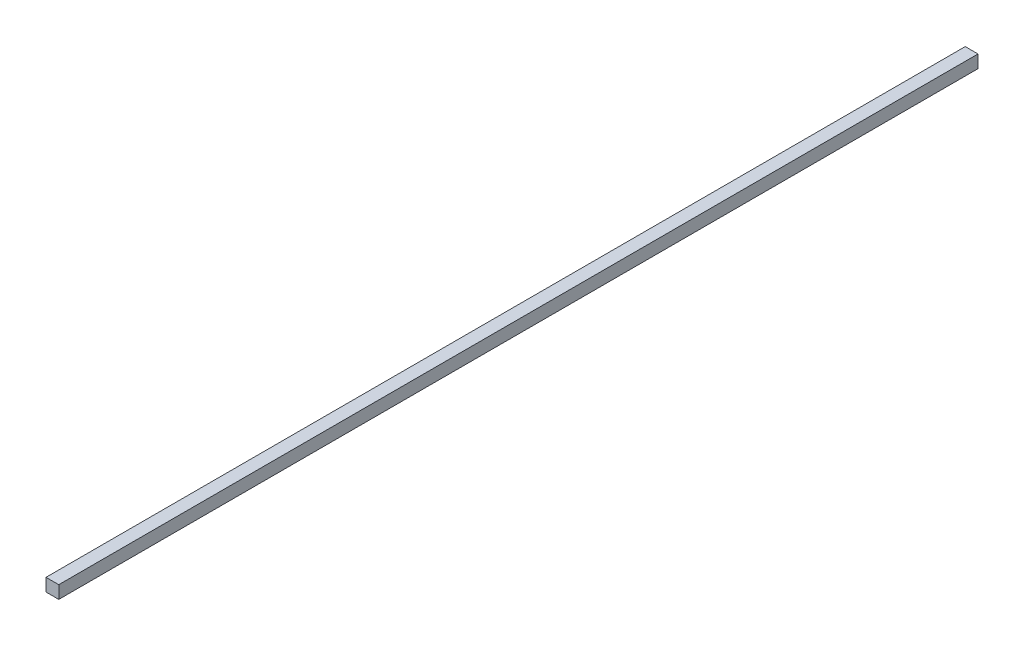
ISO-10303-21;
HEADER;
FILE_DESCRIPTION(('STEP AP214'),'2;1');
FILE_NAME('part.step','',(''),(''),'','','');
FILE_SCHEMA(('AUTOMOTIVE_DESIGN { 1 0 10303 214 1 1 1 1 }'));
ENDSEC;
DATA;
#1=APPLICATION_CONTEXT('core data for automotive mechanical design processes');
#2=APPLICATION_PROTOCOL_DEFINITION('international standard','automotive_design',2000,#1);
#3=PRODUCT_CONTEXT('',#1,'mechanical');
#4=PRODUCT('Part','Part','',(#3));
#5=PRODUCT_RELATED_PRODUCT_CATEGORY('part','',(#4));
#6=PRODUCT_DEFINITION_FORMATION('','',#4);
#7=PRODUCT_DEFINITION_CONTEXT('part definition',#1,'design');
#8=PRODUCT_DEFINITION('design','',#6,#7);
#9=PRODUCT_DEFINITION_SHAPE('','',#8);
#10=(LENGTH_UNIT() NAMED_UNIT(*) SI_UNIT(.MILLI.,.METRE.));
#11=(NAMED_UNIT(*) PLANE_ANGLE_UNIT() SI_UNIT($,.RADIAN.));
#12=(NAMED_UNIT(*) SI_UNIT($,.STERADIAN.) SOLID_ANGLE_UNIT());
#13=UNCERTAINTY_MEASURE_WITH_UNIT(LENGTH_MEASURE(1.E-05),#10,'distance_accuracy_value','');
#14=(GEOMETRIC_REPRESENTATION_CONTEXT(3) GLOBAL_UNCERTAINTY_ASSIGNED_CONTEXT((#13)) GLOBAL_UNIT_ASSIGNED_CONTEXT((#10,
#11,#12)) REPRESENTATION_CONTEXT('',''));
#15=CARTESIAN_POINT('',(0.,0.,0.));
#16=DIRECTION('',(0.,0.,1.));
#17=DIRECTION('',(1.,0.,0.));
#18=AXIS2_PLACEMENT_3D('',#15,#16,#17);
#19=CARTESIAN_POINT('',(10.,-10.,1440.));
#20=DIRECTION('',(-1.,0.,0.));
#21=DIRECTION('',(0.,0.,1.));
#22=AXIS2_PLACEMENT_3D('',#19,#20,#21);
#23=PLANE('',#22);
#24=DIRECTION('',(0.,1.,0.));
#25=VECTOR('',#24,1.);
#26=CARTESIAN_POINT('',(10.,-10.,0.));
#27=LINE('',#26,#25);
#28=CARTESIAN_POINT('',(10.,-10.,0.));
#29=VERTEX_POINT('',#28);
#30=CARTESIAN_POINT('',(10.,10.,0.));
#31=VERTEX_POINT('',#30);
#32=EDGE_CURVE('E97',#29,#31,#27,.T.);
#33=ORIENTED_EDGE('',*,*,#32,.T.);
#34=DIRECTION('',(0.,0.,-1.));
#35=VECTOR('',#34,1.);
#36=CARTESIAN_POINT('',(10.,10.,1440.));
#37=LINE('',#36,#35);
#38=CARTESIAN_POINT('',(10.,10.,1440.));
#39=VERTEX_POINT('',#38);
#40=EDGE_CURVE('E11',#39,#31,#37,.T.);
#41=ORIENTED_EDGE('',*,*,#40,.F.);
#42=DIRECTION('',(0.,1.,0.));
#43=VECTOR('',#42,1.);
#44=CARTESIAN_POINT('',(10.,-10.,1440.));
#45=LINE('',#44,#43);
#46=CARTESIAN_POINT('',(10.,-10.,1440.));
#47=VERTEX_POINT('',#46);
#48=EDGE_CURVE('E85',#47,#39,#45,.T.);
#49=ORIENTED_EDGE('',*,*,#48,.F.);
#50=DIRECTION('',(0.,0.,-1.));
#51=VECTOR('',#50,1.);
#52=CARTESIAN_POINT('',(10.,-10.,1440.));
#53=LINE('',#52,#51);
#54=EDGE_CURVE('E93',#47,#29,#53,.T.);
#55=ORIENTED_EDGE('',*,*,#54,.T.);
#56=EDGE_LOOP('',(#33,#41,#49,#55));
#57=FACE_BOUND('',#56,.T.);
#58=ADVANCED_FACE('F34',(#57),#23,.F.);
#59=CARTESIAN_POINT('',(-10.,10.,1440.));
#60=DIRECTION('',(0.,-1.,0.));
#61=DIRECTION('',(0.,0.,-1.));
#62=AXIS2_PLACEMENT_3D('',#59,#60,#61);
#63=PLANE('',#62);
#64=DIRECTION('',(-1.,0.,0.));
#65=VECTOR('',#64,1.);
#66=CARTESIAN_POINT('',(-10.,10.,0.));
#67=LINE('',#66,#65);
#68=CARTESIAN_POINT('',(-10.,10.,0.));
#69=VERTEX_POINT('',#68);
#70=EDGE_CURVE('E89',#31,#69,#67,.T.);
#71=ORIENTED_EDGE('',*,*,#70,.T.);
#72=DIRECTION('',(0.,0.,-1.));
#73=VECTOR('',#72,1.);
#74=CARTESIAN_POINT('',(-10.,10.,1440.));
#75=LINE('',#74,#73);
#76=CARTESIAN_POINT('',(-10.,10.,1440.));
#77=VERTEX_POINT('',#76);
#78=EDGE_CURVE('E42',#77,#69,#75,.T.);
#79=ORIENTED_EDGE('',*,*,#78,.F.);
#80=DIRECTION('',(-1.,0.,0.));
#81=VECTOR('',#80,1.);
#82=CARTESIAN_POINT('',(-10.,10.,1440.));
#83=LINE('',#82,#81);
#84=EDGE_CURVE('E80',#39,#77,#83,.T.);
#85=ORIENTED_EDGE('',*,*,#84,.F.);
#86=ORIENTED_EDGE('',*,*,#40,.T.);
#87=EDGE_LOOP('',(#71,#79,#85,#86));
#88=FACE_BOUND('',#87,.T.);
#89=ADVANCED_FACE('F88',(#88),#63,.F.);
#90=CARTESIAN_POINT('',(-10.,-10.,1440.));
#91=DIRECTION('',(1.,0.,0.));
#92=DIRECTION('',(0.,0.,-1.));
#93=AXIS2_PLACEMENT_3D('',#90,#91,#92);
#94=PLANE('',#93);
#95=DIRECTION('',(0.,-1.,0.));
#96=VECTOR('',#95,1.);
#97=CARTESIAN_POINT('',(-10.,-10.,0.));
#98=LINE('',#97,#96);
#99=CARTESIAN_POINT('',(-10.,-10.,0.));
#100=VERTEX_POINT('',#99);
#101=EDGE_CURVE('E67',#69,#100,#98,.T.);
#102=ORIENTED_EDGE('',*,*,#101,.T.);
#103=DIRECTION('',(0.,0.,-1.));
#104=VECTOR('',#103,1.);
#105=CARTESIAN_POINT('',(-10.,-10.,1440.));
#106=LINE('',#105,#104);
#107=CARTESIAN_POINT('',(-10.,-10.,1440.));
#108=VERTEX_POINT('',#107);
#109=EDGE_CURVE('E90',#108,#100,#106,.T.);
#110=ORIENTED_EDGE('',*,*,#109,.F.);
#111=DIRECTION('',(0.,-1.,0.));
#112=VECTOR('',#111,1.);
#113=CARTESIAN_POINT('',(-10.,-10.,1440.));
#114=LINE('',#113,#112);
#115=EDGE_CURVE('E83',#77,#108,#114,.T.);
#116=ORIENTED_EDGE('',*,*,#115,.F.);
#117=ORIENTED_EDGE('',*,*,#78,.T.);
#118=EDGE_LOOP('',(#102,#110,#116,#117));
#119=FACE_BOUND('',#118,.T.);
#120=ADVANCED_FACE('F91',(#119),#94,.F.);
#121=CARTESIAN_POINT('',(-10.,-10.,1440.));
#122=DIRECTION('',(0.,1.,0.));
#123=DIRECTION('',(0.,0.,1.));
#124=AXIS2_PLACEMENT_3D('',#121,#122,#123);
#125=PLANE('',#124);
#126=DIRECTION('',(1.,0.,0.));
#127=VECTOR('',#126,1.);
#128=CARTESIAN_POINT('',(-10.,-10.,0.));
#129=LINE('',#128,#127);
#130=EDGE_CURVE('E73',#100,#29,#129,.T.);
#131=ORIENTED_EDGE('',*,*,#130,.T.);
#132=ORIENTED_EDGE('',*,*,#54,.F.);
#133=DIRECTION('',(1.,0.,0.));
#134=VECTOR('',#133,1.);
#135=CARTESIAN_POINT('',(-10.,-10.,1440.));
#136=LINE('',#135,#134);
#137=EDGE_CURVE('E50',#108,#47,#136,.T.);
#138=ORIENTED_EDGE('',*,*,#137,.F.);
#139=ORIENTED_EDGE('',*,*,#109,.T.);
#140=EDGE_LOOP('',(#131,#132,#138,#139));
#141=FACE_BOUND('',#140,.T.);
#142=ADVANCED_FACE('F104',(#141),#125,.F.);
#143=CARTESIAN_POINT('',(0.,0.,1440.));
#144=DIRECTION('',(0.,0.,-1.));
#145=DIRECTION('',(-1.,0.,0.));
#146=AXIS2_PLACEMENT_3D('',#143,#144,#145);
#147=PLANE('',#146);
#148=ORIENTED_EDGE('',*,*,#48,.T.);
#149=ORIENTED_EDGE('',*,*,#84,.T.);
#150=ORIENTED_EDGE('',*,*,#115,.T.);
#151=ORIENTED_EDGE('',*,*,#137,.T.);
#152=EDGE_LOOP('',(#148,#149,#150,#151));
#153=FACE_BOUND('',#152,.T.);
#154=ADVANCED_FACE('F81',(#153),#147,.F.);
#155=CARTESIAN_POINT('',(0.,0.,0.));
#156=DIRECTION('',(0.,0.,-1.));
#157=DIRECTION('',(-1.,0.,0.));
#158=AXIS2_PLACEMENT_3D('',#155,#156,#157);
#159=PLANE('',#158);
#160=ORIENTED_EDGE('',*,*,#32,.F.);
#161=ORIENTED_EDGE('',*,*,#130,.F.);
#162=ORIENTED_EDGE('',*,*,#101,.F.);
#163=ORIENTED_EDGE('',*,*,#70,.F.);
#164=EDGE_LOOP('',(#160,#161,#162,#163));
#165=FACE_BOUND('',#164,.T.);
#166=ADVANCED_FACE('F107',(#165),#159,.T.);
#167=CLOSED_SHELL('',(#58,#89,#120,#142,#154,#166));
#168=MANIFOLD_SOLID_BREP('B2',#167);
#169=ADVANCED_BREP_SHAPE_REPRESENTATION('',(#18,#168),#14);
#170=SHAPE_DEFINITION_REPRESENTATION(#9,#169);
ENDSEC;
END-ISO-10303-21;
